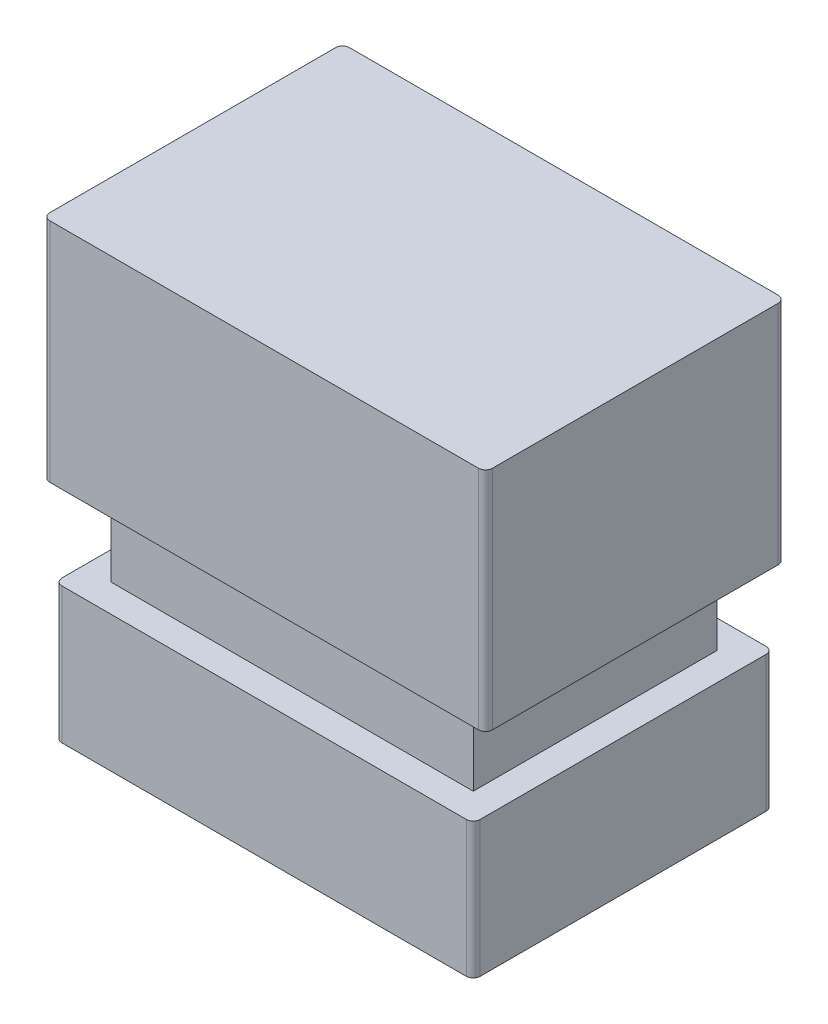
ISO-10303-21;
HEADER;
FILE_DESCRIPTION(('STEP AP214'),'2;1');
FILE_NAME('part.step','',(''),(''),'','','');
FILE_SCHEMA(('AUTOMOTIVE_DESIGN { 1 0 10303 214 1 1 1 1 }'));
ENDSEC;
DATA;
#1=APPLICATION_CONTEXT('core data for automotive mechanical design processes');
#2=APPLICATION_PROTOCOL_DEFINITION('international standard','automotive_design',2000,#1);
#3=PRODUCT_CONTEXT('',#1,'mechanical');
#4=PRODUCT('Part','Part','',(#3));
#5=PRODUCT_RELATED_PRODUCT_CATEGORY('part','',(#4));
#6=PRODUCT_DEFINITION_FORMATION('','',#4);
#7=PRODUCT_DEFINITION_CONTEXT('part definition',#1,'design');
#8=PRODUCT_DEFINITION('design','',#6,#7);
#9=PRODUCT_DEFINITION_SHAPE('','',#8);
#10=(LENGTH_UNIT() NAMED_UNIT(*) SI_UNIT(.MILLI.,.METRE.));
#11=(NAMED_UNIT(*) PLANE_ANGLE_UNIT() SI_UNIT($,.RADIAN.));
#12=(NAMED_UNIT(*) SI_UNIT($,.STERADIAN.) SOLID_ANGLE_UNIT());
#13=UNCERTAINTY_MEASURE_WITH_UNIT(LENGTH_MEASURE(1.E-05),#10,'distance_accuracy_value','');
#14=(GEOMETRIC_REPRESENTATION_CONTEXT(3) GLOBAL_UNCERTAINTY_ASSIGNED_CONTEXT((#13)) GLOBAL_UNIT_ASSIGNED_CONTEXT((#10,
#11,#12)) REPRESENTATION_CONTEXT('',''));
#15=CARTESIAN_POINT('',(0.,0.,0.));
#16=DIRECTION('',(0.,0.,1.));
#17=DIRECTION('',(1.,0.,0.));
#18=AXIS2_PLACEMENT_3D('',#15,#16,#17);
#19=CARTESIAN_POINT('',(300.,195.,-215.));
#20=DIRECTION('',(-1.,0.,0.));
#21=DIRECTION('',(0.,0.,1.));
#22=AXIS2_PLACEMENT_3D('',#19,#20,#21);
#23=PLANE('',#22);
#24=DIRECTION('',(0.,0.,-1.));
#25=VECTOR('',#24,1.);
#26=CARTESIAN_POINT('',(300.,0.,-215.));
#27=LINE('',#26,#25);
#28=CARTESIAN_POINT('',(300.,0.,205.));
#29=VERTEX_POINT('',#28);
#30=CARTESIAN_POINT('',(300.,0.,-205.));
#31=VERTEX_POINT('',#30);
#32=EDGE_CURVE('E233',#29,#31,#27,.T.);
#33=ORIENTED_EDGE('',*,*,#32,.T.);
#34=DIRECTION('',(0.,-1.,0.));
#35=VECTOR('',#34,1.);
#36=CARTESIAN_POINT('',(300.,195.,-205.));
#37=LINE('',#36,#35);
#38=CARTESIAN_POINT('',(300.,195.,-205.));
#39=VERTEX_POINT('',#38);
#40=EDGE_CURVE('E355',#31,#39,#37,.F.);
#41=ORIENTED_EDGE('',*,*,#40,.T.);
#42=DIRECTION('',(0.,0.,-1.));
#43=VECTOR('',#42,1.);
#44=CARTESIAN_POINT('',(300.,195.,-215.));
#45=LINE('',#44,#43);
#46=CARTESIAN_POINT('',(300.,195.,205.));
#47=VERTEX_POINT('',#46);
#48=EDGE_CURVE('E234',#47,#39,#45,.T.);
#49=ORIENTED_EDGE('',*,*,#48,.F.);
#50=DIRECTION('',(0.,-1.,0.));
#51=VECTOR('',#50,1.);
#52=CARTESIAN_POINT('',(300.,195.,205.));
#53=LINE('',#52,#51);
#54=EDGE_CURVE('E351',#47,#29,#53,.T.);
#55=ORIENTED_EDGE('',*,*,#54,.T.);
#56=EDGE_LOOP('',(#33,#41,#49,#55));
#57=FACE_BOUND('',#56,.T.);
#58=ADVANCED_FACE('F39',(#57),#23,.F.);
#59=CARTESIAN_POINT('',(-300.,195.,-215.));
#60=DIRECTION('',(0.,0.,1.));
#61=DIRECTION('',(1.,0.,0.));
#62=AXIS2_PLACEMENT_3D('',#59,#60,#61);
#63=PLANE('',#62);
#64=DIRECTION('',(-1.,0.,0.));
#65=VECTOR('',#64,1.);
#66=CARTESIAN_POINT('',(-300.,0.,-215.));
#67=LINE('',#66,#65);
#68=CARTESIAN_POINT('',(290.,0.,-215.));
#69=VERTEX_POINT('',#68);
#70=CARTESIAN_POINT('',(-290.,0.,-215.));
#71=VERTEX_POINT('',#70);
#72=EDGE_CURVE('E253',#69,#71,#67,.T.);
#73=ORIENTED_EDGE('',*,*,#72,.T.);
#74=DIRECTION('',(0.,-1.,0.));
#75=VECTOR('',#74,1.);
#76=CARTESIAN_POINT('',(-290.,195.,-215.));
#77=LINE('',#76,#75);
#78=CARTESIAN_POINT('',(-290.,195.,-215.));
#79=VERTEX_POINT('',#78);
#80=EDGE_CURVE('E337',#71,#79,#77,.F.);
#81=ORIENTED_EDGE('',*,*,#80,.T.);
#82=DIRECTION('',(-1.,0.,0.));
#83=VECTOR('',#82,1.);
#84=CARTESIAN_POINT('',(-300.,195.,-215.));
#85=LINE('',#84,#83);
#86=CARTESIAN_POINT('',(290.,195.,-215.));
#87=VERTEX_POINT('',#86);
#88=EDGE_CURVE('E238',#87,#79,#85,.T.);
#89=ORIENTED_EDGE('',*,*,#88,.F.);
#90=DIRECTION('',(0.,-1.,0.));
#91=VECTOR('',#90,1.);
#92=CARTESIAN_POINT('',(290.,195.,-215.));
#93=LINE('',#92,#91);
#94=EDGE_CURVE('E333',#87,#69,#93,.T.);
#95=ORIENTED_EDGE('',*,*,#94,.T.);
#96=EDGE_LOOP('',(#73,#81,#89,#95));
#97=FACE_BOUND('',#96,.T.);
#98=ADVANCED_FACE('F382',(#97),#63,.F.);
#99=CARTESIAN_POINT('',(-300.,195.,-215.));
#100=DIRECTION('',(1.,0.,0.));
#101=DIRECTION('',(0.,0.,-1.));
#102=AXIS2_PLACEMENT_3D('',#99,#100,#101);
#103=PLANE('',#102);
#104=DIRECTION('',(0.,0.,1.));
#105=VECTOR('',#104,1.);
#106=CARTESIAN_POINT('',(-300.,195.,-215.));
#107=LINE('',#106,#105);
#108=CARTESIAN_POINT('',(-300.,195.,-205.));
#109=VERTEX_POINT('',#108);
#110=CARTESIAN_POINT('',(-300.,195.,205.));
#111=VERTEX_POINT('',#110);
#112=EDGE_CURVE('E243',#109,#111,#107,.T.);
#113=ORIENTED_EDGE('',*,*,#112,.F.);
#114=DIRECTION('',(0.,-1.,0.));
#115=VECTOR('',#114,1.);
#116=CARTESIAN_POINT('',(-300.,195.,-205.));
#117=LINE('',#116,#115);
#118=CARTESIAN_POINT('',(-300.,0.,-205.));
#119=VERTEX_POINT('',#118);
#120=EDGE_CURVE('E317',#109,#119,#117,.T.);
#121=ORIENTED_EDGE('',*,*,#120,.T.);
#122=DIRECTION('',(0.,0.,1.));
#123=VECTOR('',#122,1.);
#124=CARTESIAN_POINT('',(-300.,0.,-215.));
#125=LINE('',#124,#123);
#126=CARTESIAN_POINT('',(-300.,0.,205.));
#127=VERTEX_POINT('',#126);
#128=EDGE_CURVE('E257',#119,#127,#125,.T.);
#129=ORIENTED_EDGE('',*,*,#128,.T.);
#130=DIRECTION('',(0.,-1.,0.));
#131=VECTOR('',#130,1.);
#132=CARTESIAN_POINT('',(-300.,195.,205.));
#133=LINE('',#132,#131);
#134=EDGE_CURVE('E314',#127,#111,#133,.F.);
#135=ORIENTED_EDGE('',*,*,#134,.T.);
#136=EDGE_LOOP('',(#113,#121,#129,#135));
#137=FACE_BOUND('',#136,.T.);
#138=ADVANCED_FACE('F390',(#137),#103,.F.);
#139=CARTESIAN_POINT('',(-300.,195.,215.));
#140=DIRECTION('',(0.,0.,-1.));
#141=DIRECTION('',(-1.,0.,0.));
#142=AXIS2_PLACEMENT_3D('',#139,#140,#141);
#143=PLANE('',#142);
#144=DIRECTION('',(1.,0.,0.));
#145=VECTOR('',#144,1.);
#146=CARTESIAN_POINT('',(-300.,0.,215.));
#147=LINE('',#146,#145);
#148=CARTESIAN_POINT('',(-290.,0.,215.));
#149=VERTEX_POINT('',#148);
#150=CARTESIAN_POINT('',(290.,0.,215.));
#151=VERTEX_POINT('',#150);
#152=EDGE_CURVE('E239',#149,#151,#147,.T.);
#153=ORIENTED_EDGE('',*,*,#152,.T.);
#154=DIRECTION('',(0.,-1.,0.));
#155=VECTOR('',#154,1.);
#156=CARTESIAN_POINT('',(290.,195.,215.));
#157=LINE('',#156,#155);
#158=CARTESIAN_POINT('',(290.,195.,215.));
#159=VERTEX_POINT('',#158);
#160=EDGE_CURVE('E11',#151,#159,#157,.F.);
#161=ORIENTED_EDGE('',*,*,#160,.T.);
#162=DIRECTION('',(1.,0.,0.));
#163=VECTOR('',#162,1.);
#164=CARTESIAN_POINT('',(-300.,195.,215.));
#165=LINE('',#164,#163);
#166=CARTESIAN_POINT('',(-290.,195.,215.));
#167=VERTEX_POINT('',#166);
#168=EDGE_CURVE('E246',#167,#159,#165,.T.);
#169=ORIENTED_EDGE('',*,*,#168,.F.);
#170=DIRECTION('',(0.,-1.,0.));
#171=VECTOR('',#170,1.);
#172=CARTESIAN_POINT('',(-290.,195.,215.));
#173=LINE('',#172,#171);
#174=EDGE_CURVE('E48',#167,#149,#173,.T.);
#175=ORIENTED_EDGE('',*,*,#174,.T.);
#176=EDGE_LOOP('',(#153,#161,#169,#175));
#177=FACE_BOUND('',#176,.T.);
#178=ADVANCED_FACE('F361',(#177),#143,.F.);
#179=CARTESIAN_POINT('',(0.,195.,0.));
#180=DIRECTION('',(0.,1.,0.));
#181=DIRECTION('',(0.,0.,1.));
#182=AXIS2_PLACEMENT_3D('',#179,#180,#181);
#183=PLANE('',#182);
#184=DIRECTION('',(0.,0.,-1.));
#185=VECTOR('',#184,1.);
#186=CARTESIAN_POINT('',(260.,195.,-175.));
#187=LINE('',#186,#185);
#188=CARTESIAN_POINT('',(260.,195.,175.));
#189=VERTEX_POINT('',#188);
#190=CARTESIAN_POINT('',(260.,195.,-175.));
#191=VERTEX_POINT('',#190);
#192=EDGE_CURVE('E211',#189,#191,#187,.T.);
#193=ORIENTED_EDGE('',*,*,#192,.F.);
#194=DIRECTION('',(1.,0.,0.));
#195=VECTOR('',#194,1.);
#196=CARTESIAN_POINT('',(-260.,195.,175.));
#197=LINE('',#196,#195);
#198=CARTESIAN_POINT('',(-260.,195.,175.));
#199=VERTEX_POINT('',#198);
#200=EDGE_CURVE('E190',#199,#189,#197,.T.);
#201=ORIENTED_EDGE('',*,*,#200,.F.);
#202=DIRECTION('',(0.,0.,1.));
#203=VECTOR('',#202,1.);
#204=CARTESIAN_POINT('',(-260.,195.,-175.));
#205=LINE('',#204,#203);
#206=CARTESIAN_POINT('',(-260.,195.,-175.));
#207=VERTEX_POINT('',#206);
#208=EDGE_CURVE('E219',#207,#199,#205,.T.);
#209=ORIENTED_EDGE('',*,*,#208,.F.);
#210=DIRECTION('',(-1.,0.,0.));
#211=VECTOR('',#210,1.);
#212=CARTESIAN_POINT('',(-260.,195.,-175.));
#213=LINE('',#212,#211);
#214=EDGE_CURVE('E214',#191,#207,#213,.T.);
#215=ORIENTED_EDGE('',*,*,#214,.F.);
#216=EDGE_LOOP('',(#193,#201,#209,#215));
#217=FACE_BOUND('',#216,.T.);
#218=ORIENTED_EDGE('',*,*,#88,.T.);
#219=CARTESIAN_POINT('',(-290.,195.,-205.));
#220=DIRECTION('',(0.,1.,0.));
#221=DIRECTION('',(0.,0.,1.));
#222=AXIS2_PLACEMENT_3D('',#219,#220,#221);
#223=CIRCLE('',#222,10.);
#224=EDGE_CURVE('E348',#79,#109,#223,.T.);
#225=ORIENTED_EDGE('',*,*,#224,.T.);
#226=ORIENTED_EDGE('',*,*,#112,.T.);
#227=CARTESIAN_POINT('',(-290.,195.,205.));
#228=DIRECTION('',(0.,1.,0.));
#229=DIRECTION('',(0.,0.,1.));
#230=AXIS2_PLACEMENT_3D('',#227,#228,#229);
#231=CIRCLE('',#230,10.);
#232=EDGE_CURVE('E60',#111,#167,#231,.T.);
#233=ORIENTED_EDGE('',*,*,#232,.T.);
#234=ORIENTED_EDGE('',*,*,#168,.T.);
#235=CARTESIAN_POINT('',(290.,195.,205.));
#236=DIRECTION('',(0.,1.,0.));
#237=DIRECTION('',(0.,0.,1.));
#238=AXIS2_PLACEMENT_3D('',#235,#236,#237);
#239=CIRCLE('',#238,10.);
#240=EDGE_CURVE('E342',#159,#47,#239,.T.);
#241=ORIENTED_EDGE('',*,*,#240,.T.);
#242=ORIENTED_EDGE('',*,*,#48,.T.);
#243=CARTESIAN_POINT('',(290.,195.,-205.));
#244=DIRECTION('',(0.,1.,0.));
#245=DIRECTION('',(0.,0.,1.));
#246=AXIS2_PLACEMENT_3D('',#243,#244,#245);
#247=CIRCLE('',#246,10.);
#248=EDGE_CURVE('E345',#39,#87,#247,.T.);
#249=ORIENTED_EDGE('',*,*,#248,.T.);
#250=EDGE_LOOP('',(#218,#225,#226,#233,#234,#241,#242,#249));
#251=FACE_BOUND('',#250,.T.);
#252=ADVANCED_FACE('F375',(#217,#251),#183,.T.);
#253=CARTESIAN_POINT('',(0.,0.,0.));
#254=DIRECTION('',(0.,1.,0.));
#255=DIRECTION('',(0.,0.,1.));
#256=AXIS2_PLACEMENT_3D('',#253,#254,#255);
#257=PLANE('',#256);
#258=ORIENTED_EDGE('',*,*,#128,.F.);
#259=CARTESIAN_POINT('',(-290.,0.,-205.));
#260=DIRECTION('',(0.,1.,0.));
#261=DIRECTION('',(0.,0.,1.));
#262=AXIS2_PLACEMENT_3D('',#259,#260,#261);
#263=CIRCLE('',#262,10.);
#264=EDGE_CURVE('E330',#119,#71,#263,.F.);
#265=ORIENTED_EDGE('',*,*,#264,.T.);
#266=ORIENTED_EDGE('',*,*,#72,.F.);
#267=CARTESIAN_POINT('',(290.,0.,-205.));
#268=DIRECTION('',(0.,1.,0.));
#269=DIRECTION('',(0.,0.,1.));
#270=AXIS2_PLACEMENT_3D('',#267,#268,#269);
#271=CIRCLE('',#270,10.);
#272=EDGE_CURVE('E327',#69,#31,#271,.F.);
#273=ORIENTED_EDGE('',*,*,#272,.T.);
#274=ORIENTED_EDGE('',*,*,#32,.F.);
#275=CARTESIAN_POINT('',(290.,0.,205.));
#276=DIRECTION('',(0.,1.,0.));
#277=DIRECTION('',(0.,0.,1.));
#278=AXIS2_PLACEMENT_3D('',#275,#276,#277);
#279=CIRCLE('',#278,10.);
#280=EDGE_CURVE('E324',#29,#151,#279,.F.);
#281=ORIENTED_EDGE('',*,*,#280,.T.);
#282=ORIENTED_EDGE('',*,*,#152,.F.);
#283=CARTESIAN_POINT('',(-290.,0.,205.));
#284=DIRECTION('',(0.,1.,0.));
#285=DIRECTION('',(0.,0.,1.));
#286=AXIS2_PLACEMENT_3D('',#283,#284,#285);
#287=CIRCLE('',#286,10.);
#288=EDGE_CURVE('E321',#149,#127,#287,.F.);
#289=ORIENTED_EDGE('',*,*,#288,.T.);
#290=EDGE_LOOP('',(#258,#265,#266,#273,#274,#281,#282,#289));
#291=FACE_BOUND('',#290,.T.);
#292=ADVANCED_FACE('F365',(#291),#257,.F.);
#293=CARTESIAN_POINT('',(260.,315.,-175.));
#294=DIRECTION('',(-1.,0.,0.));
#295=DIRECTION('',(0.,0.,1.));
#296=AXIS2_PLACEMENT_3D('',#293,#294,#295);
#297=PLANE('',#296);
#298=ORIENTED_EDGE('',*,*,#192,.T.);
#299=DIRECTION('',(0.,-1.,0.));
#300=VECTOR('',#299,1.);
#301=CARTESIAN_POINT('',(260.,315.,-175.));
#302=LINE('',#301,#300);
#303=CARTESIAN_POINT('',(260.,315.,-175.));
#304=VERTEX_POINT('',#303);
#305=EDGE_CURVE('E184',#304,#191,#302,.T.);
#306=ORIENTED_EDGE('',*,*,#305,.F.);
#307=DIRECTION('',(0.,0.,-1.));
#308=VECTOR('',#307,1.);
#309=CARTESIAN_POINT('',(260.,315.,-175.));
#310=LINE('',#309,#308);
#311=CARTESIAN_POINT('',(260.,315.,175.));
#312=VERTEX_POINT('',#311);
#313=EDGE_CURVE('E178',#312,#304,#310,.T.);
#314=ORIENTED_EDGE('',*,*,#313,.F.);
#315=DIRECTION('',(0.,-1.,0.));
#316=VECTOR('',#315,1.);
#317=CARTESIAN_POINT('',(260.,315.,175.));
#318=LINE('',#317,#316);
#319=EDGE_CURVE('E182',#312,#189,#318,.T.);
#320=ORIENTED_EDGE('',*,*,#319,.T.);
#321=EDGE_LOOP('',(#298,#306,#314,#320));
#322=FACE_BOUND('',#321,.T.);
#323=ADVANCED_FACE('F181',(#322),#297,.F.);
#324=CARTESIAN_POINT('',(-260.,315.,-175.));
#325=DIRECTION('',(0.,0.,1.));
#326=DIRECTION('',(1.,0.,0.));
#327=AXIS2_PLACEMENT_3D('',#324,#325,#326);
#328=PLANE('',#327);
#329=ORIENTED_EDGE('',*,*,#214,.T.);
#330=DIRECTION('',(0.,-1.,0.));
#331=VECTOR('',#330,1.);
#332=CARTESIAN_POINT('',(-260.,315.,-175.));
#333=LINE('',#332,#331);
#334=CARTESIAN_POINT('',(-260.,315.,-175.));
#335=VERTEX_POINT('',#334);
#336=EDGE_CURVE('E227',#335,#207,#333,.T.);
#337=ORIENTED_EDGE('',*,*,#336,.F.);
#338=DIRECTION('',(-1.,0.,0.));
#339=VECTOR('',#338,1.);
#340=CARTESIAN_POINT('',(-260.,315.,-175.));
#341=LINE('',#340,#339);
#342=EDGE_CURVE('E189',#304,#335,#341,.T.);
#343=ORIENTED_EDGE('',*,*,#342,.F.);
#344=ORIENTED_EDGE('',*,*,#305,.T.);
#345=EDGE_LOOP('',(#329,#337,#343,#344));
#346=FACE_BOUND('',#345,.T.);
#347=ADVANCED_FACE('F533',(#346),#328,.F.);
#348=CARTESIAN_POINT('',(-260.,315.,-175.));
#349=DIRECTION('',(1.,0.,0.));
#350=DIRECTION('',(0.,0.,-1.));
#351=AXIS2_PLACEMENT_3D('',#348,#349,#350);
#352=PLANE('',#351);
#353=ORIENTED_EDGE('',*,*,#208,.T.);
#354=DIRECTION('',(0.,-1.,0.));
#355=VECTOR('',#354,1.);
#356=CARTESIAN_POINT('',(-260.,315.,175.));
#357=LINE('',#356,#355);
#358=CARTESIAN_POINT('',(-260.,315.,175.));
#359=VERTEX_POINT('',#358);
#360=EDGE_CURVE('E200',#359,#199,#357,.T.);
#361=ORIENTED_EDGE('',*,*,#360,.F.);
#362=DIRECTION('',(0.,0.,1.));
#363=VECTOR('',#362,1.);
#364=CARTESIAN_POINT('',(-260.,315.,-175.));
#365=LINE('',#364,#363);
#366=EDGE_CURVE('E204',#335,#359,#365,.T.);
#367=ORIENTED_EDGE('',*,*,#366,.F.);
#368=ORIENTED_EDGE('',*,*,#336,.T.);
#369=EDGE_LOOP('',(#353,#361,#367,#368));
#370=FACE_BOUND('',#369,.T.);
#371=ADVANCED_FACE('F525',(#370),#352,.F.);
#372=CARTESIAN_POINT('',(-260.,315.,175.));
#373=DIRECTION('',(0.,0.,-1.));
#374=DIRECTION('',(-1.,0.,0.));
#375=AXIS2_PLACEMENT_3D('',#372,#373,#374);
#376=PLANE('',#375);
#377=ORIENTED_EDGE('',*,*,#200,.T.);
#378=ORIENTED_EDGE('',*,*,#319,.F.);
#379=DIRECTION('',(1.,0.,0.));
#380=VECTOR('',#379,1.);
#381=CARTESIAN_POINT('',(-260.,315.,175.));
#382=LINE('',#381,#380);
#383=EDGE_CURVE('E197',#359,#312,#382,.T.);
#384=ORIENTED_EDGE('',*,*,#383,.F.);
#385=ORIENTED_EDGE('',*,*,#360,.T.);
#386=EDGE_LOOP('',(#377,#378,#384,#385));
#387=FACE_BOUND('',#386,.T.);
#388=ADVANCED_FACE('F195',(#387),#376,.F.);
#389=CARTESIAN_POINT('',(0.,315.,0.));
#390=DIRECTION('',(0.,1.,0.));
#391=DIRECTION('',(0.,0.,1.));
#392=AXIS2_PLACEMENT_3D('',#389,#390,#391);
#393=PLANE('',#392);
#394=DIRECTION('',(0.,0.,1.));
#395=VECTOR('',#394,1.);
#396=CARTESIAN_POINT('',(-317.5,315.,-215.));
#397=LINE('',#396,#395);
#398=CARTESIAN_POINT('',(-317.5,315.,-205.));
#399=VERTEX_POINT('',#398);
#400=CARTESIAN_POINT('',(-317.5,315.,205.));
#401=VERTEX_POINT('',#400);
#402=EDGE_CURVE('E613',#399,#401,#397,.T.);
#403=ORIENTED_EDGE('',*,*,#402,.F.);
#404=CARTESIAN_POINT('',(-307.5,315.,-205.));
#405=DIRECTION('',(0.,1.,0.));
#406=DIRECTION('',(0.,0.,1.));
#407=AXIS2_PLACEMENT_3D('',#404,#405,#406);
#408=CIRCLE('',#407,10.);
#409=CARTESIAN_POINT('',(-307.5,315.,-215.));
#410=VERTEX_POINT('',#409);
#411=EDGE_CURVE('E278',#399,#410,#408,.F.);
#412=ORIENTED_EDGE('',*,*,#411,.T.);
#413=DIRECTION('',(-1.,0.,0.));
#414=VECTOR('',#413,1.);
#415=CARTESIAN_POINT('',(-317.5,315.,-215.));
#416=LINE('',#415,#414);
#417=CARTESIAN_POINT('',(307.5,315.,-215.));
#418=VERTEX_POINT('',#417);
#419=EDGE_CURVE('E617',#418,#410,#416,.T.);
#420=ORIENTED_EDGE('',*,*,#419,.F.);
#421=CARTESIAN_POINT('',(307.5,315.,-205.));
#422=DIRECTION('',(0.,1.,0.));
#423=DIRECTION('',(0.,0.,1.));
#424=AXIS2_PLACEMENT_3D('',#421,#422,#423);
#425=CIRCLE('',#424,10.);
#426=CARTESIAN_POINT('',(317.5,315.,-205.));
#427=VERTEX_POINT('',#426);
#428=EDGE_CURVE('E275',#418,#427,#425,.F.);
#429=ORIENTED_EDGE('',*,*,#428,.T.);
#430=DIRECTION('',(0.,0.,-1.));
#431=VECTOR('',#430,1.);
#432=CARTESIAN_POINT('',(317.5,315.,-215.));
#433=LINE('',#432,#431);
#434=CARTESIAN_POINT('',(317.5,315.,205.));
#435=VERTEX_POINT('',#434);
#436=EDGE_CURVE('E621',#435,#427,#433,.T.);
#437=ORIENTED_EDGE('',*,*,#436,.F.);
#438=CARTESIAN_POINT('',(307.5,315.,205.));
#439=DIRECTION('',(0.,1.,0.));
#440=DIRECTION('',(0.,0.,1.));
#441=AXIS2_PLACEMENT_3D('',#438,#439,#440);
#442=CIRCLE('',#441,10.);
#443=CARTESIAN_POINT('',(307.5,315.,215.));
#444=VERTEX_POINT('',#443);
#445=EDGE_CURVE('E272',#435,#444,#442,.F.);
#446=ORIENTED_EDGE('',*,*,#445,.T.);
#447=DIRECTION('',(1.,0.,0.));
#448=VECTOR('',#447,1.);
#449=CARTESIAN_POINT('',(-317.5,315.,215.));
#450=LINE('',#449,#448);
#451=CARTESIAN_POINT('',(-307.5,315.,215.));
#452=VERTEX_POINT('',#451);
#453=EDGE_CURVE('E608',#452,#444,#450,.T.);
#454=ORIENTED_EDGE('',*,*,#453,.F.);
#455=CARTESIAN_POINT('',(-307.5,315.,205.));
#456=DIRECTION('',(0.,1.,0.));
#457=DIRECTION('',(0.,0.,1.));
#458=AXIS2_PLACEMENT_3D('',#455,#456,#457);
#459=CIRCLE('',#458,10.);
#460=EDGE_CURVE('E269',#452,#401,#459,.F.);
#461=ORIENTED_EDGE('',*,*,#460,.T.);
#462=EDGE_LOOP('',(#403,#412,#420,#429,#437,#446,#454,#461));
#463=FACE_BOUND('',#462,.T.);
#464=ORIENTED_EDGE('',*,*,#383,.T.);
#465=ORIENTED_EDGE('',*,*,#313,.T.);
#466=ORIENTED_EDGE('',*,*,#342,.T.);
#467=ORIENTED_EDGE('',*,*,#366,.T.);
#468=EDGE_LOOP('',(#464,#465,#466,#467));
#469=FACE_BOUND('',#468,.T.);
#470=ADVANCED_FACE('F202',(#463,#469),#393,.F.);
#471=CARTESIAN_POINT('',(317.5,640.,-215.));
#472=DIRECTION('',(-1.,0.,0.));
#473=DIRECTION('',(0.,0.,1.));
#474=AXIS2_PLACEMENT_3D('',#471,#472,#473);
#475=PLANE('',#474);
#476=ORIENTED_EDGE('',*,*,#436,.T.);
#477=DIRECTION('',(0.,-1.,0.));
#478=VECTOR('',#477,1.);
#479=CARTESIAN_POINT('',(317.5,640.,-205.));
#480=LINE('',#479,#478);
#481=CARTESIAN_POINT('',(317.5,640.,-205.));
#482=VERTEX_POINT('',#481);
#483=EDGE_CURVE('E304',#427,#482,#480,.F.);
#484=ORIENTED_EDGE('',*,*,#483,.T.);
#485=DIRECTION('',(0.,0.,-1.));
#486=VECTOR('',#485,1.);
#487=CARTESIAN_POINT('',(317.5,640.,-215.));
#488=LINE('',#487,#486);
#489=CARTESIAN_POINT('',(317.5,640.,205.));
#490=VERTEX_POINT('',#489);
#491=EDGE_CURVE('E612',#490,#482,#488,.T.);
#492=ORIENTED_EDGE('',*,*,#491,.F.);
#493=DIRECTION('',(0.,-1.,0.));
#494=VECTOR('',#493,1.);
#495=CARTESIAN_POINT('',(317.5,640.,205.));
#496=LINE('',#495,#494);
#497=EDGE_CURVE('E300',#490,#435,#496,.T.);
#498=ORIENTED_EDGE('',*,*,#497,.T.);
#499=EDGE_LOOP('',(#476,#484,#492,#498));
#500=FACE_BOUND('',#499,.T.);
#501=ADVANCED_FACE('F500',(#500),#475,.F.);
#502=CARTESIAN_POINT('',(-317.5,640.,-215.));
#503=DIRECTION('',(0.,0.,1.));
#504=DIRECTION('',(1.,0.,0.));
#505=AXIS2_PLACEMENT_3D('',#502,#503,#504);
#506=PLANE('',#505);
#507=ORIENTED_EDGE('',*,*,#419,.T.);
#508=DIRECTION('',(0.,-1.,0.));
#509=VECTOR('',#508,1.);
#510=CARTESIAN_POINT('',(-307.5,640.,-215.));
#511=LINE('',#510,#509);
#512=CARTESIAN_POINT('',(-307.5,640.,-215.));
#513=VERTEX_POINT('',#512);
#514=EDGE_CURVE('E285',#410,#513,#511,.F.);
#515=ORIENTED_EDGE('',*,*,#514,.T.);
#516=DIRECTION('',(-1.,0.,0.));
#517=VECTOR('',#516,1.);
#518=CARTESIAN_POINT('',(-317.5,640.,-215.));
#519=LINE('',#518,#517);
#520=CARTESIAN_POINT('',(307.5,640.,-215.));
#521=VERTEX_POINT('',#520);
#522=EDGE_CURVE('E632',#521,#513,#519,.T.);
#523=ORIENTED_EDGE('',*,*,#522,.F.);
#524=DIRECTION('',(0.,-1.,0.));
#525=VECTOR('',#524,1.);
#526=CARTESIAN_POINT('',(307.5,640.,-215.));
#527=LINE('',#526,#525);
#528=EDGE_CURVE('E281',#521,#418,#527,.T.);
#529=ORIENTED_EDGE('',*,*,#528,.T.);
#530=EDGE_LOOP('',(#507,#515,#523,#529));
#531=FACE_BOUND('',#530,.T.);
#532=ADVANCED_FACE('F491',(#531),#506,.F.);
#533=CARTESIAN_POINT('',(-317.5,640.,-215.));
#534=DIRECTION('',(1.,0.,0.));
#535=DIRECTION('',(0.,0.,-1.));
#536=AXIS2_PLACEMENT_3D('',#533,#534,#535);
#537=PLANE('',#536);
#538=DIRECTION('',(0.,0.,1.));
#539=VECTOR('',#538,1.);
#540=CARTESIAN_POINT('',(-317.5,640.,-215.));
#541=LINE('',#540,#539);
#542=CARTESIAN_POINT('',(-317.5,640.,-205.));
#543=VERTEX_POINT('',#542);
#544=CARTESIAN_POINT('',(-317.5,640.,205.));
#545=VERTEX_POINT('',#544);
#546=EDGE_CURVE('E628',#543,#545,#541,.T.);
#547=ORIENTED_EDGE('',*,*,#546,.F.);
#548=DIRECTION('',(0.,-1.,0.));
#549=VECTOR('',#548,1.);
#550=CARTESIAN_POINT('',(-317.5,640.,-205.));
#551=LINE('',#550,#549);
#552=EDGE_CURVE('E265',#543,#399,#551,.T.);
#553=ORIENTED_EDGE('',*,*,#552,.T.);
#554=ORIENTED_EDGE('',*,*,#402,.T.);
#555=DIRECTION('',(0.,-1.,0.));
#556=VECTOR('',#555,1.);
#557=CARTESIAN_POINT('',(-317.5,640.,205.));
#558=LINE('',#557,#556);
#559=EDGE_CURVE('E249',#401,#545,#558,.F.);
#560=ORIENTED_EDGE('',*,*,#559,.T.);
#561=EDGE_LOOP('',(#547,#553,#554,#560));
#562=FACE_BOUND('',#561,.T.);
#563=ADVANCED_FACE('F482',(#562),#537,.F.);
#564=CARTESIAN_POINT('',(-317.5,640.,215.));
#565=DIRECTION('',(0.,0.,-1.));
#566=DIRECTION('',(-1.,0.,0.));
#567=AXIS2_PLACEMENT_3D('',#564,#565,#566);
#568=PLANE('',#567);
#569=ORIENTED_EDGE('',*,*,#453,.T.);
#570=DIRECTION('',(0.,-1.,0.));
#571=VECTOR('',#570,1.);
#572=CARTESIAN_POINT('',(307.5,640.,215.));
#573=LINE('',#572,#571);
#574=CARTESIAN_POINT('',(307.5,640.,215.));
#575=VERTEX_POINT('',#574);
#576=EDGE_CURVE('E311',#444,#575,#573,.F.);
#577=ORIENTED_EDGE('',*,*,#576,.T.);
#578=DIRECTION('',(1.,0.,0.));
#579=VECTOR('',#578,1.);
#580=CARTESIAN_POINT('',(-317.5,640.,215.));
#581=LINE('',#580,#579);
#582=CARTESIAN_POINT('',(-307.5,640.,215.));
#583=VERTEX_POINT('',#582);
#584=EDGE_CURVE('E215',#583,#575,#581,.T.);
#585=ORIENTED_EDGE('',*,*,#584,.F.);
#586=DIRECTION('',(0.,-1.,0.));
#587=VECTOR('',#586,1.);
#588=CARTESIAN_POINT('',(-307.5,640.,215.));
#589=LINE('',#588,#587);
#590=EDGE_CURVE('E307',#583,#452,#589,.T.);
#591=ORIENTED_EDGE('',*,*,#590,.T.);
#592=EDGE_LOOP('',(#569,#577,#585,#591));
#593=FACE_BOUND('',#592,.T.);
#594=ADVANCED_FACE('F473',(#593),#568,.F.);
#595=CARTESIAN_POINT('',(0.,640.,0.));
#596=DIRECTION('',(0.,1.,0.));
#597=DIRECTION('',(0.,0.,1.));
#598=AXIS2_PLACEMENT_3D('',#595,#596,#597);
#599=PLANE('',#598);
#600=ORIENTED_EDGE('',*,*,#522,.T.);
#601=CARTESIAN_POINT('',(-307.5,640.,-205.));
#602=DIRECTION('',(0.,1.,0.));
#603=DIRECTION('',(0.,0.,1.));
#604=AXIS2_PLACEMENT_3D('',#601,#602,#603);
#605=CIRCLE('',#604,10.);
#606=EDGE_CURVE('E297',#513,#543,#605,.T.);
#607=ORIENTED_EDGE('',*,*,#606,.T.);
#608=ORIENTED_EDGE('',*,*,#546,.T.);
#609=CARTESIAN_POINT('',(-307.5,640.,205.));
#610=DIRECTION('',(0.,1.,0.));
#611=DIRECTION('',(0.,0.,1.));
#612=AXIS2_PLACEMENT_3D('',#609,#610,#611);
#613=CIRCLE('',#612,10.);
#614=EDGE_CURVE('E288',#545,#583,#613,.T.);
#615=ORIENTED_EDGE('',*,*,#614,.T.);
#616=ORIENTED_EDGE('',*,*,#584,.T.);
#617=CARTESIAN_POINT('',(307.5,640.,205.));
#618=DIRECTION('',(0.,1.,0.));
#619=DIRECTION('',(0.,0.,1.));
#620=AXIS2_PLACEMENT_3D('',#617,#618,#619);
#621=CIRCLE('',#620,10.);
#622=EDGE_CURVE('E291',#575,#490,#621,.T.);
#623=ORIENTED_EDGE('',*,*,#622,.T.);
#624=ORIENTED_EDGE('',*,*,#491,.T.);
#625=CARTESIAN_POINT('',(307.5,640.,-205.));
#626=DIRECTION('',(0.,1.,0.));
#627=DIRECTION('',(0.,0.,1.));
#628=AXIS2_PLACEMENT_3D('',#625,#626,#627);
#629=CIRCLE('',#628,10.);
#630=EDGE_CURVE('E294',#482,#521,#629,.T.);
#631=ORIENTED_EDGE('',*,*,#630,.T.);
#632=EDGE_LOOP('',(#600,#607,#608,#615,#616,#623,#624,#631));
#633=FACE_BOUND('',#632,.T.);
#634=ADVANCED_FACE('F408',(#633),#599,.T.);
#635=CARTESIAN_POINT('',(-307.5,640.,-205.));
#636=DIRECTION('',(0.,-1.,0.));
#637=DIRECTION('',(0.,0.,-1.));
#638=AXIS2_PLACEMENT_3D('',#635,#636,#637);
#639=CYLINDRICAL_SURFACE('',#638,10.);
#640=ORIENTED_EDGE('',*,*,#606,.F.);
#641=ORIENTED_EDGE('',*,*,#514,.F.);
#642=ORIENTED_EDGE('',*,*,#411,.F.);
#643=ORIENTED_EDGE('',*,*,#552,.F.);
#644=EDGE_LOOP('',(#640,#641,#642,#643));
#645=FACE_BOUND('',#644,.T.);
#646=ADVANCED_FACE('F404',(#645),#639,.T.);
#647=CARTESIAN_POINT('',(307.5,640.,-205.));
#648=DIRECTION('',(0.,-1.,0.));
#649=DIRECTION('',(0.,0.,-1.));
#650=AXIS2_PLACEMENT_3D('',#647,#648,#649);
#651=CYLINDRICAL_SURFACE('',#650,10.);
#652=ORIENTED_EDGE('',*,*,#630,.F.);
#653=ORIENTED_EDGE('',*,*,#483,.F.);
#654=ORIENTED_EDGE('',*,*,#428,.F.);
#655=ORIENTED_EDGE('',*,*,#528,.F.);
#656=EDGE_LOOP('',(#652,#653,#654,#655));
#657=FACE_BOUND('',#656,.T.);
#658=ADVANCED_FACE('F407',(#657),#651,.T.);
#659=CARTESIAN_POINT('',(307.5,640.,205.));
#660=DIRECTION('',(0.,-1.,0.));
#661=DIRECTION('',(0.,0.,-1.));
#662=AXIS2_PLACEMENT_3D('',#659,#660,#661);
#663=CYLINDRICAL_SURFACE('',#662,10.);
#664=ORIENTED_EDGE('',*,*,#622,.F.);
#665=ORIENTED_EDGE('',*,*,#576,.F.);
#666=ORIENTED_EDGE('',*,*,#445,.F.);
#667=ORIENTED_EDGE('',*,*,#497,.F.);
#668=EDGE_LOOP('',(#664,#665,#666,#667));
#669=FACE_BOUND('',#668,.T.);
#670=ADVANCED_FACE('F412',(#669),#663,.T.);
#671=CARTESIAN_POINT('',(-307.5,640.,205.));
#672=DIRECTION('',(0.,-1.,0.));
#673=DIRECTION('',(0.,0.,-1.));
#674=AXIS2_PLACEMENT_3D('',#671,#672,#673);
#675=CYLINDRICAL_SURFACE('',#674,10.);
#676=ORIENTED_EDGE('',*,*,#614,.F.);
#677=ORIENTED_EDGE('',*,*,#559,.F.);
#678=ORIENTED_EDGE('',*,*,#460,.F.);
#679=ORIENTED_EDGE('',*,*,#590,.F.);
#680=EDGE_LOOP('',(#676,#677,#678,#679));
#681=FACE_BOUND('',#680,.T.);
#682=ADVANCED_FACE('F416',(#681),#675,.T.);
#683=CARTESIAN_POINT('',(-290.,195.,-205.));
#684=DIRECTION('',(0.,-1.,0.));
#685=DIRECTION('',(0.,0.,-1.));
#686=AXIS2_PLACEMENT_3D('',#683,#684,#685);
#687=CYLINDRICAL_SURFACE('',#686,10.);
#688=ORIENTED_EDGE('',*,*,#224,.F.);
#689=ORIENTED_EDGE('',*,*,#80,.F.);
#690=ORIENTED_EDGE('',*,*,#264,.F.);
#691=ORIENTED_EDGE('',*,*,#120,.F.);
#692=EDGE_LOOP('',(#688,#689,#690,#691));
#693=FACE_BOUND('',#692,.T.);
#694=ADVANCED_FACE('F387',(#693),#687,.T.);
#695=CARTESIAN_POINT('',(290.,195.,-205.));
#696=DIRECTION('',(0.,-1.,0.));
#697=DIRECTION('',(0.,0.,-1.));
#698=AXIS2_PLACEMENT_3D('',#695,#696,#697);
#699=CYLINDRICAL_SURFACE('',#698,10.);
#700=ORIENTED_EDGE('',*,*,#248,.F.);
#701=ORIENTED_EDGE('',*,*,#40,.F.);
#702=ORIENTED_EDGE('',*,*,#272,.F.);
#703=ORIENTED_EDGE('',*,*,#94,.F.);
#704=EDGE_LOOP('',(#700,#701,#702,#703));
#705=FACE_BOUND('',#704,.T.);
#706=ADVANCED_FACE('F379',(#705),#699,.T.);
#707=CARTESIAN_POINT('',(290.,195.,205.));
#708=DIRECTION('',(0.,-1.,0.));
#709=DIRECTION('',(0.,0.,-1.));
#710=AXIS2_PLACEMENT_3D('',#707,#708,#709);
#711=CYLINDRICAL_SURFACE('',#710,10.);
#712=ORIENTED_EDGE('',*,*,#240,.F.);
#713=ORIENTED_EDGE('',*,*,#160,.F.);
#714=ORIENTED_EDGE('',*,*,#280,.F.);
#715=ORIENTED_EDGE('',*,*,#54,.F.);
#716=EDGE_LOOP('',(#712,#713,#714,#715));
#717=FACE_BOUND('',#716,.T.);
#718=ADVANCED_FACE('F370',(#717),#711,.T.);
#719=CARTESIAN_POINT('',(-290.,195.,205.));
#720=DIRECTION('',(0.,-1.,0.));
#721=DIRECTION('',(0.,0.,-1.));
#722=AXIS2_PLACEMENT_3D('',#719,#720,#721);
#723=CYLINDRICAL_SURFACE('',#722,10.);
#724=ORIENTED_EDGE('',*,*,#232,.F.);
#725=ORIENTED_EDGE('',*,*,#134,.F.);
#726=ORIENTED_EDGE('',*,*,#288,.F.);
#727=ORIENTED_EDGE('',*,*,#174,.F.);
#728=EDGE_LOOP('',(#724,#725,#726,#727));
#729=FACE_BOUND('',#728,.T.);
#730=ADVANCED_FACE('F41',(#729),#723,.T.);
#731=CLOSED_SHELL('',(#58,#98,#138,#178,#252,#292,#323,#347,#371,#388,#470,#501,#532,#563,#594,
#634,#646,#658,#670,#682,#694,#706,#718,#730));
#732=MANIFOLD_SOLID_BREP('B2',#731);
#733=ADVANCED_BREP_SHAPE_REPRESENTATION('',(#18,#732),#14);
#734=SHAPE_DEFINITION_REPRESENTATION(#9,#733);
ENDSEC;
END-ISO-10303-21;
